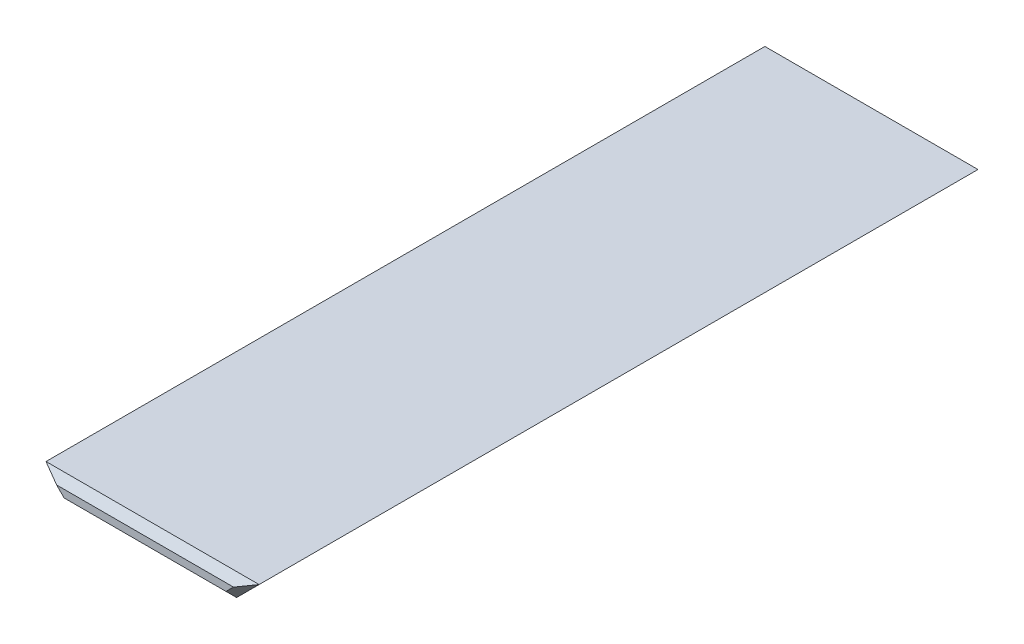
ISO-10303-21;
HEADER;
FILE_DESCRIPTION(('STEP AP214'),'2;1');
FILE_NAME('part.step','',(''),(''),'','','');
FILE_SCHEMA(('AUTOMOTIVE_DESIGN { 1 0 10303 214 1 1 1 1 }'));
ENDSEC;
DATA;
#1=APPLICATION_CONTEXT('core data for automotive mechanical design processes');
#2=APPLICATION_PROTOCOL_DEFINITION('international standard','automotive_design',2000,#1);
#3=PRODUCT_CONTEXT('',#1,'mechanical');
#4=PRODUCT('Part','Part','',(#3));
#5=PRODUCT_RELATED_PRODUCT_CATEGORY('part','',(#4));
#6=PRODUCT_DEFINITION_FORMATION('','',#4);
#7=PRODUCT_DEFINITION_CONTEXT('part definition',#1,'design');
#8=PRODUCT_DEFINITION('design','',#6,#7);
#9=PRODUCT_DEFINITION_SHAPE('','',#8);
#10=(LENGTH_UNIT() NAMED_UNIT(*) SI_UNIT(.MILLI.,.METRE.));
#11=(NAMED_UNIT(*) PLANE_ANGLE_UNIT() SI_UNIT($,.RADIAN.));
#12=(NAMED_UNIT(*) SI_UNIT($,.STERADIAN.) SOLID_ANGLE_UNIT());
#13=UNCERTAINTY_MEASURE_WITH_UNIT(LENGTH_MEASURE(1.E-05),#10,'distance_accuracy_value','');
#14=(GEOMETRIC_REPRESENTATION_CONTEXT(3) GLOBAL_UNCERTAINTY_ASSIGNED_CONTEXT((#13)) GLOBAL_UNIT_ASSIGNED_CONTEXT((#10,
#11,#12)) REPRESENTATION_CONTEXT('',''));
#15=CARTESIAN_POINT('',(0.,0.,0.));
#16=DIRECTION('',(0.,0.,1.));
#17=DIRECTION('',(1.,0.,0.));
#18=AXIS2_PLACEMENT_3D('',#15,#16,#17);
#19=CARTESIAN_POINT('',(11.2,0.,96.8));
#20=DIRECTION('',(-0.707106781186549,0.707106781186546,0.));
#21=DIRECTION('',(-0.707106781186546,-0.707106781186549,0.));
#22=AXIS2_PLACEMENT_3D('',#19,#20,#21);
#23=PLANE('',#22);
#24=DIRECTION('',(0.,0.,-1.));
#25=VECTOR('',#24,1.);
#26=CARTESIAN_POINT('',(11.2,0.,96.8));
#27=LINE('',#26,#25);
#28=CARTESIAN_POINT('',(11.2,0.,95.8));
#29=VERTEX_POINT('',#28);
#30=CARTESIAN_POINT('',(11.2,0.,3.));
#31=VERTEX_POINT('',#30);
#32=EDGE_CURVE('E91',#29,#31,#27,.T.);
#33=ORIENTED_EDGE('',*,*,#32,.T.);
#34=DIRECTION('',(-0.577350269189625,-0.577350269189627,0.577350269189625));
#35=VECTOR('',#34,1.);
#36=CARTESIAN_POINT('',(3.73333333333335,-7.46666666666669,10.4666666666666));
#37=LINE('',#36,#35);
#38=CARTESIAN_POINT('',(14.2,3.,0.));
#39=VERTEX_POINT('',#38);
#40=EDGE_CURVE('E43',#31,#39,#37,.F.);
#41=ORIENTED_EDGE('',*,*,#40,.T.);
#42=DIRECTION('',(0.,0.,-1.));
#43=VECTOR('',#42,1.);
#44=CARTESIAN_POINT('',(14.2,3.,96.8));
#45=LINE('',#44,#43);
#46=CARTESIAN_POINT('',(14.2,3.,95.8));
#47=VERTEX_POINT('',#46);
#48=EDGE_CURVE('E88',#47,#39,#45,.T.);
#49=ORIENTED_EDGE('',*,*,#48,.F.);
#50=DIRECTION('',(-0.707106781186546,-0.707106781186549,0.));
#51=VECTOR('',#50,1.);
#52=CARTESIAN_POINT('',(11.2,0.,95.8));
#53=LINE('',#52,#51);
#54=EDGE_CURVE('E127',#47,#29,#53,.T.);
#55=ORIENTED_EDGE('',*,*,#54,.T.);
#56=EDGE_LOOP('',(#33,#41,#49,#55));
#57=FACE_BOUND('',#56,.T.);
#58=ADVANCED_FACE('F35',(#57),#23,.F.);
#59=CARTESIAN_POINT('',(14.2,3.,96.8));
#60=DIRECTION('',(0.,-1.,0.));
#61=DIRECTION('',(0.,0.,-1.));
#62=AXIS2_PLACEMENT_3D('',#59,#60,#61);
#63=PLANE('',#62);
#64=DIRECTION('',(0.,0.,-1.));
#65=VECTOR('',#64,1.);
#66=CARTESIAN_POINT('',(-14.2,3.,96.8));
#67=LINE('',#66,#65);
#68=CARTESIAN_POINT('',(-14.2,3.,95.8));
#69=VERTEX_POINT('',#68);
#70=CARTESIAN_POINT('',(-14.2,3.,0.));
#71=VERTEX_POINT('',#70);
#72=EDGE_CURVE('E101',#69,#71,#67,.T.);
#73=ORIENTED_EDGE('',*,*,#72,.F.);
#74=DIRECTION('',(1.,0.,0.));
#75=VECTOR('',#74,1.);
#76=CARTESIAN_POINT('',(14.2,3.,95.8));
#77=LINE('',#76,#75);
#78=EDGE_CURVE('E99',#69,#47,#77,.T.);
#79=ORIENTED_EDGE('',*,*,#78,.T.);
#80=ORIENTED_EDGE('',*,*,#48,.T.);
#81=DIRECTION('',(-1.,0.,0.));
#82=VECTOR('',#81,1.);
#83=CARTESIAN_POINT('',(14.2,3.,0.));
#84=LINE('',#83,#82);
#85=EDGE_CURVE('E97',#39,#71,#84,.T.);
#86=ORIENTED_EDGE('',*,*,#85,.T.);
#87=EDGE_LOOP('',(#73,#79,#80,#86));
#88=FACE_BOUND('',#87,.T.);
#89=ADVANCED_FACE('F96',(#88),#63,.F.);
#90=CARTESIAN_POINT('',(-11.2,0.,96.8));
#91=DIRECTION('',(0.707106781186549,0.707106781186546,0.));
#92=DIRECTION('',(-0.707106781186546,0.707106781186549,0.));
#93=AXIS2_PLACEMENT_3D('',#90,#91,#92);
#94=PLANE('',#93);
#95=ORIENTED_EDGE('',*,*,#72,.T.);
#96=DIRECTION('',(-0.577350269189625,0.577350269189627,-0.577350269189625));
#97=VECTOR('',#96,1.);
#98=CARTESIAN_POINT('',(-11.2,0.,2.99999999999999));
#99=LINE('',#98,#97);
#100=CARTESIAN_POINT('',(-11.2,0.,3.00000000000001));
#101=VERTEX_POINT('',#100);
#102=EDGE_CURVE('E11',#71,#101,#99,.F.);
#103=ORIENTED_EDGE('',*,*,#102,.T.);
#104=DIRECTION('',(0.,0.,-1.));
#105=VECTOR('',#104,1.);
#106=CARTESIAN_POINT('',(-11.2,0.,96.8));
#107=LINE('',#106,#105);
#108=CARTESIAN_POINT('',(-11.2,0.,95.8));
#109=VERTEX_POINT('',#108);
#110=EDGE_CURVE('E105',#109,#101,#107,.T.);
#111=ORIENTED_EDGE('',*,*,#110,.F.);
#112=DIRECTION('',(-0.707106781186546,0.707106781186549,0.));
#113=VECTOR('',#112,1.);
#114=CARTESIAN_POINT('',(-14.2,3.,95.8));
#115=LINE('',#114,#113);
#116=EDGE_CURVE('E124',#109,#69,#115,.T.);
#117=ORIENTED_EDGE('',*,*,#116,.T.);
#118=EDGE_LOOP('',(#95,#103,#111,#117));
#119=FACE_BOUND('',#118,.T.);
#120=ADVANCED_FACE('F138',(#119),#94,.F.);
#121=CARTESIAN_POINT('',(-11.2,0.,96.8));
#122=DIRECTION('',(0.,1.,0.));
#123=DIRECTION('',(0.,0.,1.));
#124=AXIS2_PLACEMENT_3D('',#121,#122,#123);
#125=PLANE('',#124);
#126=ORIENTED_EDGE('',*,*,#110,.T.);
#127=DIRECTION('',(1.,0.,0.));
#128=VECTOR('',#127,1.);
#129=CARTESIAN_POINT('',(-11.2,0.,2.99999999999999));
#130=LINE('',#129,#128);
#131=EDGE_CURVE('E92',#101,#31,#130,.T.);
#132=ORIENTED_EDGE('',*,*,#131,.T.);
#133=ORIENTED_EDGE('',*,*,#32,.F.);
#134=DIRECTION('',(-1.,0.,0.));
#135=VECTOR('',#134,1.);
#136=CARTESIAN_POINT('',(-11.2,0.,95.8));
#137=LINE('',#136,#135);
#138=EDGE_CURVE('E121',#29,#109,#137,.T.);
#139=ORIENTED_EDGE('',*,*,#138,.T.);
#140=EDGE_LOOP('',(#126,#132,#133,#139));
#141=FACE_BOUND('',#140,.T.);
#142=ADVANCED_FACE('F136',(#141),#125,.F.);
#143=CARTESIAN_POINT('',(0.,0.,96.8));
#144=DIRECTION('',(0.,0.,1.));
#145=DIRECTION('',(1.,0.,0.));
#146=AXIS2_PLACEMENT_3D('',#143,#144,#145);
#147=PLANE('',#146);
#148=DIRECTION('',(0.707106781186546,-0.707106781186549,0.));
#149=VECTOR('',#148,1.);
#150=CARTESIAN_POINT('',(-10.4928932188135,0.707106781186548,96.8));
#151=LINE('',#150,#149);
#152=CARTESIAN_POINT('',(-11.7857864376269,2.,96.8));
#153=VERTEX_POINT('',#152);
#154=CARTESIAN_POINT('',(-10.7857864376269,1.,96.8));
#155=VERTEX_POINT('',#154);
#156=EDGE_CURVE('E116',#153,#155,#151,.T.);
#157=ORIENTED_EDGE('',*,*,#156,.T.);
#158=DIRECTION('',(1.,0.,0.));
#159=VECTOR('',#158,1.);
#160=CARTESIAN_POINT('',(11.2,1.,96.8));
#161=LINE('',#160,#159);
#162=CARTESIAN_POINT('',(10.7857864376269,1.,96.8));
#163=VERTEX_POINT('',#162);
#164=EDGE_CURVE('E118',#155,#163,#161,.T.);
#165=ORIENTED_EDGE('',*,*,#164,.T.);
#166=DIRECTION('',(0.707106781186546,0.707106781186549,0.));
#167=VECTOR('',#166,1.);
#168=CARTESIAN_POINT('',(13.4928932188134,3.70710678118655,96.8));
#169=LINE('',#168,#167);
#170=CARTESIAN_POINT('',(11.7857864376269,2.,96.8));
#171=VERTEX_POINT('',#170);
#172=EDGE_CURVE('E100',#163,#171,#169,.T.);
#173=ORIENTED_EDGE('',*,*,#172,.T.);
#174=DIRECTION('',(-1.,0.,0.));
#175=VECTOR('',#174,1.);
#176=CARTESIAN_POINT('',(-14.2,2.,96.8));
#177=LINE('',#176,#175);
#178=EDGE_CURVE('E114',#171,#153,#177,.T.);
#179=ORIENTED_EDGE('',*,*,#178,.T.);
#180=EDGE_LOOP('',(#157,#165,#173,#179));
#181=FACE_BOUND('',#180,.T.);
#182=ADVANCED_FACE('F151',(#181),#147,.T.);
#183=CARTESIAN_POINT('',(0.,2.,96.8));
#184=DIRECTION('',(0.,0.707106781186547,0.707106781186548));
#185=DIRECTION('',(1.,0.,0.));
#186=AXIS2_PLACEMENT_3D('',#183,#184,#185);
#187=PLANE('',#186);
#188=DIRECTION('',(-0.862856209461016,-0.357406744336594,0.357406744336594));
#189=VECTOR('',#188,1.);
#190=CARTESIAN_POINT('',(4.52818012770008,-1.00619896393625,99.8061989639363));
#191=LINE('',#190,#189);
#192=EDGE_CURVE('E108',#47,#171,#191,.T.);
#193=ORIENTED_EDGE('',*,*,#192,.F.);
#194=ORIENTED_EDGE('',*,*,#78,.F.);
#195=DIRECTION('',(0.862856209461016,-0.357406744336594,0.357406744336594));
#196=VECTOR('',#195,1.);
#197=CARTESIAN_POINT('',(-3.01102284017469,-1.63462608868245,100.434626088682));
#198=LINE('',#197,#196);
#199=EDGE_CURVE('E103',#153,#69,#198,.F.);
#200=ORIENTED_EDGE('',*,*,#199,.F.);
#201=ORIENTED_EDGE('',*,*,#178,.F.);
#202=EDGE_LOOP('',(#193,#194,#200,#201));
#203=FACE_BOUND('',#202,.T.);
#204=ADVANCED_FACE('F144',(#203),#187,.T.);
#205=CARTESIAN_POINT('',(-4.89289321881348,-4.89289321881346,96.8));
#206=DIRECTION('',(-0.500000000000001,-0.499999999999999,0.707106781186548));
#207=DIRECTION('',(-0.707106781186546,0.707106781186549,0.));
#208=AXIS2_PLACEMENT_3D('',#205,#206,#207);
#209=PLANE('',#208);
#210=ORIENTED_EDGE('',*,*,#199,.T.);
#211=ORIENTED_EDGE('',*,*,#116,.F.);
#212=DIRECTION('',(0.281084637714821,0.678598344545847,0.678598344545846));
#213=VECTOR('',#212,1.);
#214=CARTESIAN_POINT('',(-11.4442288394581,-0.589620576542256,95.2103794234577));
#215=LINE('',#214,#213);
#216=EDGE_CURVE('E131',#155,#109,#215,.F.);
#217=ORIENTED_EDGE('',*,*,#216,.F.);
#218=ORIENTED_EDGE('',*,*,#156,.F.);
#219=EDGE_LOOP('',(#210,#211,#217,#218));
#220=FACE_BOUND('',#219,.T.);
#221=ADVANCED_FACE('F148',(#220),#209,.T.);
#222=CARTESIAN_POINT('',(4.89289321881348,-4.89289321881346,96.8));
#223=DIRECTION('',(0.500000000000001,-0.499999999999999,0.707106781186548));
#224=DIRECTION('',(-0.707106781186546,-0.707106781186549,0.));
#225=AXIS2_PLACEMENT_3D('',#222,#223,#224);
#226=PLANE('',#225);
#227=ORIENTED_EDGE('',*,*,#192,.T.);
#228=ORIENTED_EDGE('',*,*,#172,.F.);
#229=DIRECTION('',(0.281084637714821,-0.678598344545847,-0.678598344545846));
#230=VECTOR('',#229,1.);
#231=CARTESIAN_POINT('',(11.4442288394581,-0.589620576542256,95.2103794234577));
#232=LINE('',#231,#230);
#233=EDGE_CURVE('E129',#29,#163,#232,.F.);
#234=ORIENTED_EDGE('',*,*,#233,.F.);
#235=ORIENTED_EDGE('',*,*,#54,.F.);
#236=EDGE_LOOP('',(#227,#228,#234,#235));
#237=FACE_BOUND('',#236,.T.);
#238=ADVANCED_FACE('F154',(#237),#226,.T.);
#239=CARTESIAN_POINT('',(0.,1.,96.8));
#240=DIRECTION('',(0.,-0.707106781186547,0.707106781186548));
#241=DIRECTION('',(-1.,0.,0.));
#242=AXIS2_PLACEMENT_3D('',#239,#240,#241);
#243=PLANE('',#242);
#244=ORIENTED_EDGE('',*,*,#216,.T.);
#245=ORIENTED_EDGE('',*,*,#138,.F.);
#246=ORIENTED_EDGE('',*,*,#233,.T.);
#247=ORIENTED_EDGE('',*,*,#164,.F.);
#248=EDGE_LOOP('',(#244,#245,#246,#247));
#249=FACE_BOUND('',#248,.T.);
#250=ADVANCED_FACE('F157',(#249),#243,.T.);
#251=CARTESIAN_POINT('',(-11.2,0.,2.99999999999999));
#252=DIRECTION('',(0.,0.707106781186546,0.707106781186549));
#253=DIRECTION('',(1.,0.,0.));
#254=AXIS2_PLACEMENT_3D('',#251,#252,#253);
#255=PLANE('',#254);
#256=ORIENTED_EDGE('',*,*,#102,.F.);
#257=ORIENTED_EDGE('',*,*,#85,.F.);
#258=ORIENTED_EDGE('',*,*,#40,.F.);
#259=ORIENTED_EDGE('',*,*,#131,.F.);
#260=EDGE_LOOP('',(#256,#257,#258,#259));
#261=FACE_BOUND('',#260,.T.);
#262=ADVANCED_FACE('F37',(#261),#255,.F.);
#263=CLOSED_SHELL('',(#58,#89,#120,#142,#182,#204,#221,#238,#250,#262));
#264=MANIFOLD_SOLID_BREP('B2',#263);
#265=ADVANCED_BREP_SHAPE_REPRESENTATION('',(#18,#264),#14);
#266=SHAPE_DEFINITION_REPRESENTATION(#9,#265);
ENDSEC;
END-ISO-10303-21;
